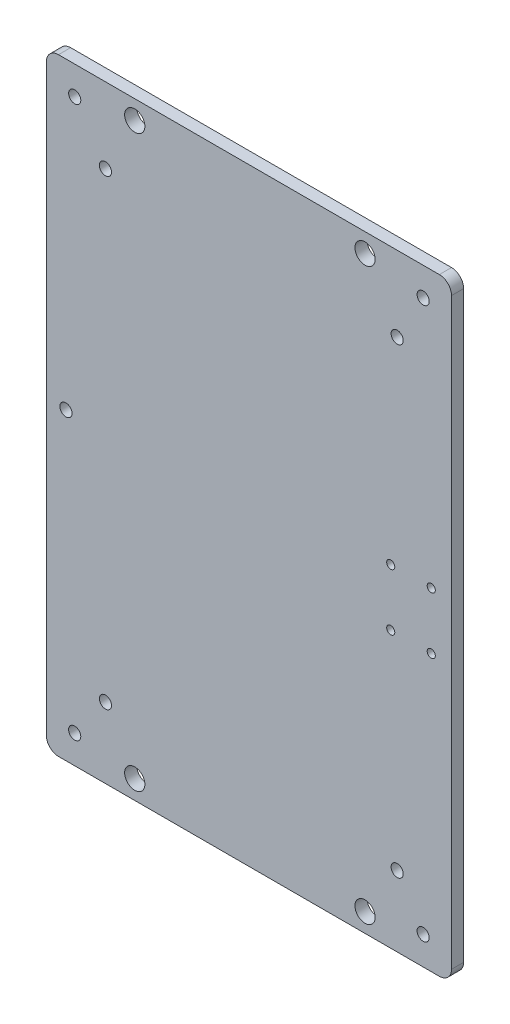
ISO-10303-21;
HEADER;
FILE_DESCRIPTION(('STEP AP214'),'2;1');
FILE_NAME('part.step','',(''),(''),'','','');
FILE_SCHEMA(('AUTOMOTIVE_DESIGN { 1 0 10303 214 1 1 1 1 }'));
ENDSEC;
DATA;
#1=APPLICATION_CONTEXT('core data for automotive mechanical design processes');
#2=APPLICATION_PROTOCOL_DEFINITION('international standard','automotive_design',2000,#1);
#3=PRODUCT_CONTEXT('',#1,'mechanical');
#4=PRODUCT('Part','Part','',(#3));
#5=PRODUCT_RELATED_PRODUCT_CATEGORY('part','',(#4));
#6=PRODUCT_DEFINITION_FORMATION('','',#4);
#7=PRODUCT_DEFINITION_CONTEXT('part definition',#1,'design');
#8=PRODUCT_DEFINITION('design','',#6,#7);
#9=PRODUCT_DEFINITION_SHAPE('','',#8);
#10=(LENGTH_UNIT() NAMED_UNIT(*) SI_UNIT(.MILLI.,.METRE.));
#11=(NAMED_UNIT(*) PLANE_ANGLE_UNIT() SI_UNIT($,.RADIAN.));
#12=(NAMED_UNIT(*) SI_UNIT($,.STERADIAN.) SOLID_ANGLE_UNIT());
#13=UNCERTAINTY_MEASURE_WITH_UNIT(LENGTH_MEASURE(1.E-05),#10,'distance_accuracy_value','');
#14=(GEOMETRIC_REPRESENTATION_CONTEXT(3) GLOBAL_UNCERTAINTY_ASSIGNED_CONTEXT((#13)) GLOBAL_UNIT_ASSIGNED_CONTEXT((#10,
#11,#12)) REPRESENTATION_CONTEXT('',''));
#15=CARTESIAN_POINT('',(0.,0.,0.));
#16=DIRECTION('',(0.,0.,1.));
#17=DIRECTION('',(1.,0.,0.));
#18=AXIS2_PLACEMENT_3D('',#15,#16,#17);
#19=CARTESIAN_POINT('',(-102.,-59.,-3.));
#20=DIRECTION('',(0.,0.,1.));
#21=DIRECTION('',(1.,0.,0.));
#22=AXIS2_PLACEMENT_3D('',#19,#20,#21);
#23=CYLINDRICAL_SURFACE('',#22,3.);
#24=CARTESIAN_POINT('',(-102.,-59.,0.));
#25=DIRECTION('',(0.,0.,1.));
#26=DIRECTION('',(1.,0.,0.));
#27=AXIS2_PLACEMENT_3D('',#24,#25,#26);
#28=CIRCLE('',#27,3.);
#29=CARTESIAN_POINT('',(-105.,-59.,0.));
#30=VERTEX_POINT('',#29);
#31=CARTESIAN_POINT('',(-102.,-62.,0.));
#32=VERTEX_POINT('',#31);
#33=EDGE_CURVE('E133',#30,#32,#28,.T.);
#34=ORIENTED_EDGE('',*,*,#33,.F.);
#35=DIRECTION('',(0.,0.,1.));
#36=VECTOR('',#35,1.);
#37=CARTESIAN_POINT('',(-105.,-59.,-3.));
#38=LINE('',#37,#36);
#39=CARTESIAN_POINT('',(-105.,-59.,-3.));
#40=VERTEX_POINT('',#39);
#41=EDGE_CURVE('E11',#40,#30,#38,.T.);
#42=ORIENTED_EDGE('',*,*,#41,.F.);
#43=CARTESIAN_POINT('',(-102.,-59.,-3.));
#44=DIRECTION('',(0.,0.,1.));
#45=DIRECTION('',(1.,0.,0.));
#46=AXIS2_PLACEMENT_3D('',#43,#44,#45);
#47=CIRCLE('',#46,3.);
#48=CARTESIAN_POINT('',(-102.,-62.,-3.));
#49=VERTEX_POINT('',#48);
#50=EDGE_CURVE('E154',#40,#49,#47,.T.);
#51=ORIENTED_EDGE('',*,*,#50,.T.);
#52=DIRECTION('',(0.,0.,1.));
#53=VECTOR('',#52,1.);
#54=CARTESIAN_POINT('',(-102.,-62.,-3.));
#55=LINE('',#54,#53);
#56=EDGE_CURVE('E39',#49,#32,#55,.T.);
#57=ORIENTED_EDGE('',*,*,#56,.T.);
#58=EDGE_LOOP('',(#34,#42,#51,#57));
#59=FACE_BOUND('',#58,.T.);
#60=ADVANCED_FACE('F36',(#59),#23,.T.);
#61=CARTESIAN_POINT('',(-105.,85.,-3.));
#62=DIRECTION('',(-1.,0.,0.));
#63=DIRECTION('',(0.,0.,1.));
#64=AXIS2_PLACEMENT_3D('',#61,#62,#63);
#65=PLANE('',#64);
#66=DIRECTION('',(0.,-1.,0.));
#67=VECTOR('',#66,1.);
#68=CARTESIAN_POINT('',(-105.,85.,0.));
#69=LINE('',#68,#67);
#70=CARTESIAN_POINT('',(-105.,85.,0.));
#71=VERTEX_POINT('',#70);
#72=EDGE_CURVE('E152',#71,#30,#69,.T.);
#73=ORIENTED_EDGE('',*,*,#72,.F.);
#74=DIRECTION('',(0.,0.,1.));
#75=VECTOR('',#74,1.);
#76=CARTESIAN_POINT('',(-105.,85.,-3.));
#77=LINE('',#76,#75);
#78=CARTESIAN_POINT('',(-105.,85.,-3.));
#79=VERTEX_POINT('',#78);
#80=EDGE_CURVE('E45',#79,#71,#77,.T.);
#81=ORIENTED_EDGE('',*,*,#80,.F.);
#82=DIRECTION('',(0.,-1.,0.));
#83=VECTOR('',#82,1.);
#84=CARTESIAN_POINT('',(-105.,85.,-3.));
#85=LINE('',#84,#83);
#86=EDGE_CURVE('E123',#79,#40,#85,.T.);
#87=ORIENTED_EDGE('',*,*,#86,.T.);
#88=ORIENTED_EDGE('',*,*,#41,.T.);
#89=EDGE_LOOP('',(#73,#81,#87,#88));
#90=FACE_BOUND('',#89,.T.);
#91=ADVANCED_FACE('F166',(#90),#65,.T.);
#92=CARTESIAN_POINT('',(-102.,85.,-3.));
#93=DIRECTION('',(0.,0.,1.));
#94=DIRECTION('',(1.,0.,0.));
#95=AXIS2_PLACEMENT_3D('',#92,#93,#94);
#96=CYLINDRICAL_SURFACE('',#95,3.);
#97=CARTESIAN_POINT('',(-102.,85.,0.));
#98=DIRECTION('',(0.,0.,1.));
#99=DIRECTION('',(1.,0.,0.));
#100=AXIS2_PLACEMENT_3D('',#97,#98,#99);
#101=CIRCLE('',#100,3.);
#102=CARTESIAN_POINT('',(-102.,88.,0.));
#103=VERTEX_POINT('',#102);
#104=EDGE_CURVE('E110',#103,#71,#101,.T.);
#105=ORIENTED_EDGE('',*,*,#104,.F.);
#106=DIRECTION('',(0.,0.,1.));
#107=VECTOR('',#106,1.);
#108=CARTESIAN_POINT('',(-102.,88.,-3.));
#109=LINE('',#108,#107);
#110=CARTESIAN_POINT('',(-102.,88.,-3.));
#111=VERTEX_POINT('',#110);
#112=EDGE_CURVE('E105',#111,#103,#109,.T.);
#113=ORIENTED_EDGE('',*,*,#112,.F.);
#114=CARTESIAN_POINT('',(-102.,85.,-3.));
#115=DIRECTION('',(0.,0.,1.));
#116=DIRECTION('',(1.,0.,0.));
#117=AXIS2_PLACEMENT_3D('',#114,#115,#116);
#118=CIRCLE('',#117,3.);
#119=EDGE_CURVE('E108',#111,#79,#118,.T.);
#120=ORIENTED_EDGE('',*,*,#119,.T.);
#121=ORIENTED_EDGE('',*,*,#80,.T.);
#122=EDGE_LOOP('',(#105,#113,#120,#121));
#123=FACE_BOUND('',#122,.T.);
#124=ADVANCED_FACE('F107',(#123),#96,.T.);
#125=CARTESIAN_POINT('',(-8.,88.,-3.));
#126=DIRECTION('',(0.,1.,0.));
#127=DIRECTION('',(0.,0.,1.));
#128=AXIS2_PLACEMENT_3D('',#125,#126,#127);
#129=PLANE('',#128);
#130=DIRECTION('',(-1.,0.,0.));
#131=VECTOR('',#130,1.);
#132=CARTESIAN_POINT('',(-8.,88.,0.));
#133=LINE('',#132,#131);
#134=CARTESIAN_POINT('',(-8.,88.,0.));
#135=VERTEX_POINT('',#134);
#136=EDGE_CURVE('E149',#135,#103,#133,.T.);
#137=ORIENTED_EDGE('',*,*,#136,.F.);
#138=DIRECTION('',(0.,0.,1.));
#139=VECTOR('',#138,1.);
#140=CARTESIAN_POINT('',(-8.,88.,-3.));
#141=LINE('',#140,#139);
#142=CARTESIAN_POINT('',(-8.,88.,-3.));
#143=VERTEX_POINT('',#142);
#144=EDGE_CURVE('E115',#143,#135,#141,.T.);
#145=ORIENTED_EDGE('',*,*,#144,.F.);
#146=DIRECTION('',(-1.,0.,0.));
#147=VECTOR('',#146,1.);
#148=CARTESIAN_POINT('',(-8.,88.,-3.));
#149=LINE('',#148,#147);
#150=EDGE_CURVE('E121',#143,#111,#149,.T.);
#151=ORIENTED_EDGE('',*,*,#150,.T.);
#152=ORIENTED_EDGE('',*,*,#112,.T.);
#153=EDGE_LOOP('',(#137,#145,#151,#152));
#154=FACE_BOUND('',#153,.T.);
#155=ADVANCED_FACE('F125',(#154),#129,.T.);
#156=CARTESIAN_POINT('',(-8.,85.,-3.));
#157=DIRECTION('',(0.,0.,1.));
#158=DIRECTION('',(1.,0.,0.));
#159=AXIS2_PLACEMENT_3D('',#156,#157,#158);
#160=CYLINDRICAL_SURFACE('',#159,2.99999999999999);
#161=CARTESIAN_POINT('',(-8.,85.,0.));
#162=DIRECTION('',(0.,0.,1.));
#163=DIRECTION('',(1.,0.,0.));
#164=AXIS2_PLACEMENT_3D('',#161,#162,#163);
#165=CIRCLE('',#164,2.99999999999999);
#166=CARTESIAN_POINT('',(-5.,85.,0.));
#167=VERTEX_POINT('',#166);
#168=EDGE_CURVE('E146',#167,#135,#165,.T.);
#169=ORIENTED_EDGE('',*,*,#168,.F.);
#170=DIRECTION('',(0.,0.,1.));
#171=VECTOR('',#170,1.);
#172=CARTESIAN_POINT('',(-5.,85.,-3.));
#173=LINE('',#172,#171);
#174=CARTESIAN_POINT('',(-5.,85.,-3.));
#175=VERTEX_POINT('',#174);
#176=EDGE_CURVE('E158',#175,#167,#173,.T.);
#177=ORIENTED_EDGE('',*,*,#176,.F.);
#178=CARTESIAN_POINT('',(-8.,85.,-3.));
#179=DIRECTION('',(0.,0.,1.));
#180=DIRECTION('',(1.,0.,0.));
#181=AXIS2_PLACEMENT_3D('',#178,#179,#180);
#182=CIRCLE('',#181,2.99999999999999);
#183=EDGE_CURVE('E126',#175,#143,#182,.T.);
#184=ORIENTED_EDGE('',*,*,#183,.T.);
#185=ORIENTED_EDGE('',*,*,#144,.T.);
#186=EDGE_LOOP('',(#169,#177,#184,#185));
#187=FACE_BOUND('',#186,.T.);
#188=ADVANCED_FACE('F179',(#187),#160,.T.);
#189=CARTESIAN_POINT('',(-5.,-59.,-3.));
#190=DIRECTION('',(1.,0.,0.));
#191=DIRECTION('',(0.,0.,-1.));
#192=AXIS2_PLACEMENT_3D('',#189,#190,#191);
#193=PLANE('',#192);
#194=DIRECTION('',(0.,1.,0.));
#195=VECTOR('',#194,1.);
#196=CARTESIAN_POINT('',(-5.,-59.,0.));
#197=LINE('',#196,#195);
#198=CARTESIAN_POINT('',(-5.,-59.,0.));
#199=VERTEX_POINT('',#198);
#200=EDGE_CURVE('E143',#199,#167,#197,.T.);
#201=ORIENTED_EDGE('',*,*,#200,.F.);
#202=DIRECTION('',(0.,0.,1.));
#203=VECTOR('',#202,1.);
#204=CARTESIAN_POINT('',(-5.,-59.,-3.));
#205=LINE('',#204,#203);
#206=CARTESIAN_POINT('',(-5.,-59.,-3.));
#207=VERTEX_POINT('',#206);
#208=EDGE_CURVE('E160',#207,#199,#205,.T.);
#209=ORIENTED_EDGE('',*,*,#208,.F.);
#210=DIRECTION('',(0.,1.,0.));
#211=VECTOR('',#210,1.);
#212=CARTESIAN_POINT('',(-5.,-59.,-3.));
#213=LINE('',#212,#211);
#214=EDGE_CURVE('E128',#207,#175,#213,.T.);
#215=ORIENTED_EDGE('',*,*,#214,.T.);
#216=ORIENTED_EDGE('',*,*,#176,.T.);
#217=EDGE_LOOP('',(#201,#209,#215,#216));
#218=FACE_BOUND('',#217,.T.);
#219=ADVANCED_FACE('F182',(#218),#193,.T.);
#220=CARTESIAN_POINT('',(-8.,-59.,-3.));
#221=DIRECTION('',(0.,0.,1.));
#222=DIRECTION('',(1.,0.,0.));
#223=AXIS2_PLACEMENT_3D('',#220,#221,#222);
#224=CYLINDRICAL_SURFACE('',#223,3.);
#225=CARTESIAN_POINT('',(-8.,-59.,0.));
#226=DIRECTION('',(0.,0.,1.));
#227=DIRECTION('',(1.,0.,0.));
#228=AXIS2_PLACEMENT_3D('',#225,#226,#227);
#229=CIRCLE('',#228,3.);
#230=CARTESIAN_POINT('',(-8.,-62.,0.));
#231=VERTEX_POINT('',#230);
#232=EDGE_CURVE('E140',#231,#199,#229,.T.);
#233=ORIENTED_EDGE('',*,*,#232,.F.);
#234=DIRECTION('',(0.,0.,1.));
#235=VECTOR('',#234,1.);
#236=CARTESIAN_POINT('',(-8.,-62.,-3.));
#237=LINE('',#236,#235);
#238=CARTESIAN_POINT('',(-8.,-62.,-3.));
#239=VERTEX_POINT('',#238);
#240=EDGE_CURVE('E161',#239,#231,#237,.T.);
#241=ORIENTED_EDGE('',*,*,#240,.F.);
#242=CARTESIAN_POINT('',(-8.,-59.,-3.));
#243=DIRECTION('',(0.,0.,1.));
#244=DIRECTION('',(1.,0.,0.));
#245=AXIS2_PLACEMENT_3D('',#242,#243,#244);
#246=CIRCLE('',#245,3.);
#247=EDGE_CURVE('E375',#239,#207,#246,.T.);
#248=ORIENTED_EDGE('',*,*,#247,.T.);
#249=ORIENTED_EDGE('',*,*,#208,.T.);
#250=EDGE_LOOP('',(#233,#241,#248,#249));
#251=FACE_BOUND('',#250,.T.);
#252=ADVANCED_FACE('F186',(#251),#224,.T.);
#253=CARTESIAN_POINT('',(-102.,-62.,-3.));
#254=DIRECTION('',(0.,-1.,0.));
#255=DIRECTION('',(0.,0.,-1.));
#256=AXIS2_PLACEMENT_3D('',#253,#254,#255);
#257=PLANE('',#256);
#258=DIRECTION('',(1.,0.,0.));
#259=VECTOR('',#258,1.);
#260=CARTESIAN_POINT('',(-102.,-62.,0.));
#261=LINE('',#260,#259);
#262=EDGE_CURVE('E136',#32,#231,#261,.T.);
#263=ORIENTED_EDGE('',*,*,#262,.F.);
#264=ORIENTED_EDGE('',*,*,#56,.F.);
#265=DIRECTION('',(1.,0.,0.));
#266=VECTOR('',#265,1.);
#267=CARTESIAN_POINT('',(-102.,-62.,-3.));
#268=LINE('',#267,#266);
#269=EDGE_CURVE('E373',#49,#239,#268,.T.);
#270=ORIENTED_EDGE('',*,*,#269,.T.);
#271=ORIENTED_EDGE('',*,*,#240,.T.);
#272=EDGE_LOOP('',(#263,#264,#270,#271));
#273=FACE_BOUND('',#272,.T.);
#274=ADVANCED_FACE('F163',(#273),#257,.T.);
#275=CARTESIAN_POINT('',(-102.,-59.,-3.));
#276=DIRECTION('',(0.,0.,1.));
#277=DIRECTION('',(1.,0.,0.));
#278=AXIS2_PLACEMENT_3D('',#275,#276,#277);
#279=PLANE('',#278);
#280=CARTESIAN_POINT('',(-26.3347200903665,83.33,-3.));
#281=DIRECTION('',(0.,0.,1.));
#282=DIRECTION('',(1.,0.,0.));
#283=AXIS2_PLACEMENT_3D('',#280,#281,#282);
#284=CIRCLE('',#283,2.5);
#285=CARTESIAN_POINT('',(-23.8347200903665,83.33,-3.));
#286=VERTEX_POINT('',#285);
#287=EDGE_CURVE('E276',#286,#286,#284,.T.);
#288=ORIENTED_EDGE('',*,*,#287,.T.);
#289=EDGE_LOOP('',(#288));
#290=FACE_BOUND('',#289,.T.);
#291=CARTESIAN_POINT('',(-83.1786162713773,83.33,-3.));
#292=DIRECTION('',(0.,0.,1.));
#293=DIRECTION('',(1.,0.,0.));
#294=AXIS2_PLACEMENT_3D('',#291,#292,#293);
#295=CIRCLE('',#294,2.5);
#296=CARTESIAN_POINT('',(-80.6786162713773,83.33,-3.));
#297=VERTEX_POINT('',#296);
#298=EDGE_CURVE('E278',#297,#297,#295,.T.);
#299=ORIENTED_EDGE('',*,*,#298,.T.);
#300=EDGE_LOOP('',(#299));
#301=FACE_BOUND('',#300,.T.);
#302=CARTESIAN_POINT('',(-26.3347200903665,-57.3266391463334,-3.));
#303=DIRECTION('',(0.,0.,1.));
#304=DIRECTION('',(1.,0.,0.));
#305=AXIS2_PLACEMENT_3D('',#302,#303,#304);
#306=CIRCLE('',#305,2.5);
#307=CARTESIAN_POINT('',(-23.8347200903665,-57.3266391463334,-3.));
#308=VERTEX_POINT('',#307);
#309=EDGE_CURVE('E292',#308,#308,#306,.T.);
#310=ORIENTED_EDGE('',*,*,#309,.T.);
#311=EDGE_LOOP('',(#310));
#312=FACE_BOUND('',#311,.T.);
#313=CARTESIAN_POINT('',(-83.1786162713773,-57.3266391463334,-3.));
#314=DIRECTION('',(0.,0.,1.));
#315=DIRECTION('',(1.,0.,0.));
#316=AXIS2_PLACEMENT_3D('',#313,#314,#315);
#317=CIRCLE('',#316,2.5);
#318=CARTESIAN_POINT('',(-80.6786162713773,-57.3266391463334,-3.));
#319=VERTEX_POINT('',#318);
#320=EDGE_CURVE('E288',#319,#319,#317,.T.);
#321=ORIENTED_EDGE('',*,*,#320,.T.);
#322=EDGE_LOOP('',(#321));
#323=FACE_BOUND('',#322,.T.);
#324=CARTESIAN_POINT('',(-90.41,69.42,-3.));
#325=DIRECTION('',(0.,0.,1.));
#326=DIRECTION('',(1.,0.,0.));
#327=AXIS2_PLACEMENT_3D('',#324,#325,#326);
#328=CIRCLE('',#327,1.5);
#329=CARTESIAN_POINT('',(-88.91,69.42,-3.));
#330=VERTEX_POINT('',#329);
#331=EDGE_CURVE('E316',#330,#330,#328,.T.);
#332=ORIENTED_EDGE('',*,*,#331,.T.);
#333=EDGE_LOOP('',(#332));
#334=FACE_BOUND('',#333,.T.);
#335=CARTESIAN_POINT('',(-18.41,69.42,-3.));
#336=DIRECTION('',(0.,0.,1.));
#337=DIRECTION('',(1.,0.,0.));
#338=AXIS2_PLACEMENT_3D('',#335,#336,#337);
#339=CIRCLE('',#338,1.5);
#340=CARTESIAN_POINT('',(-16.91,69.42,-3.));
#341=VERTEX_POINT('',#340);
#342=EDGE_CURVE('E313',#341,#341,#339,.T.);
#343=ORIENTED_EDGE('',*,*,#342,.T.);
#344=EDGE_LOOP('',(#343));
#345=FACE_BOUND('',#344,.T.);
#346=CARTESIAN_POINT('',(-18.41,-44.58,-3.));
#347=DIRECTION('',(0.,0.,1.));
#348=DIRECTION('',(1.,0.,0.));
#349=AXIS2_PLACEMENT_3D('',#346,#347,#348);
#350=CIRCLE('',#349,1.5);
#351=CARTESIAN_POINT('',(-16.91,-44.58,-3.));
#352=VERTEX_POINT('',#351);
#353=EDGE_CURVE('E310',#352,#352,#350,.T.);
#354=ORIENTED_EDGE('',*,*,#353,.T.);
#355=EDGE_LOOP('',(#354));
#356=FACE_BOUND('',#355,.T.);
#357=CARTESIAN_POINT('',(-90.41,-44.58,-3.));
#358=DIRECTION('',(0.,0.,1.));
#359=DIRECTION('',(1.,0.,0.));
#360=AXIS2_PLACEMENT_3D('',#357,#358,#359);
#361=CIRCLE('',#360,1.50000000000001);
#362=CARTESIAN_POINT('',(-88.91,-44.58,-3.));
#363=VERTEX_POINT('',#362);
#364=EDGE_CURVE('E307',#363,#363,#361,.T.);
#365=ORIENTED_EDGE('',*,*,#364,.T.);
#366=EDGE_LOOP('',(#365));
#367=FACE_BOUND('',#366,.T.);
#368=CARTESIAN_POINT('',(-10.,20.,-3.));
#369=DIRECTION('',(0.,0.,1.));
#370=DIRECTION('',(-1.,0.,0.));
#371=AXIS2_PLACEMENT_3D('',#368,#369,#370);
#372=CIRCLE('',#371,0.999999999999999);
#373=CARTESIAN_POINT('',(-11.,20.,-3.));
#374=VERTEX_POINT('',#373);
#375=EDGE_CURVE('E320',#374,#374,#372,.T.);
#376=ORIENTED_EDGE('',*,*,#375,.T.);
#377=EDGE_LOOP('',(#376));
#378=FACE_BOUND('',#377,.T.);
#379=CARTESIAN_POINT('',(-20.,6.,-3.));
#380=DIRECTION('',(0.,0.,1.));
#381=DIRECTION('',(-1.,0.,0.));
#382=AXIS2_PLACEMENT_3D('',#379,#380,#381);
#383=CIRCLE('',#382,1.);
#384=CARTESIAN_POINT('',(-21.,6.,-3.));
#385=VERTEX_POINT('',#384);
#386=EDGE_CURVE('E326',#385,#385,#383,.T.);
#387=ORIENTED_EDGE('',*,*,#386,.T.);
#388=EDGE_LOOP('',(#387));
#389=FACE_BOUND('',#388,.T.);
#390=CARTESIAN_POINT('',(-20.,20.,-3.));
#391=DIRECTION('',(0.,0.,1.));
#392=DIRECTION('',(-1.,0.,0.));
#393=AXIS2_PLACEMENT_3D('',#390,#391,#392);
#394=CIRCLE('',#393,1.);
#395=CARTESIAN_POINT('',(-21.,20.,-3.));
#396=VERTEX_POINT('',#395);
#397=EDGE_CURVE('E332',#396,#396,#394,.T.);
#398=ORIENTED_EDGE('',*,*,#397,.T.);
#399=EDGE_LOOP('',(#398));
#400=FACE_BOUND('',#399,.T.);
#401=CARTESIAN_POINT('',(-10.,6.,-3.));
#402=DIRECTION('',(0.,0.,1.));
#403=DIRECTION('',(-1.,0.,0.));
#404=AXIS2_PLACEMENT_3D('',#401,#402,#403);
#405=CIRCLE('',#404,0.999999999999999);
#406=CARTESIAN_POINT('',(-11.,6.,-3.));
#407=VERTEX_POINT('',#406);
#408=EDGE_CURVE('E338',#407,#407,#405,.T.);
#409=ORIENTED_EDGE('',*,*,#408,.T.);
#410=EDGE_LOOP('',(#409));
#411=FACE_BOUND('',#410,.T.);
#412=CARTESIAN_POINT('',(-12.,-55.,-3.));
#413=DIRECTION('',(0.,0.,1.));
#414=DIRECTION('',(-1.,0.,0.));
#415=AXIS2_PLACEMENT_3D('',#412,#413,#414);
#416=CIRCLE('',#415,1.5);
#417=CARTESIAN_POINT('',(-13.5,-55.,-3.));
#418=VERTEX_POINT('',#417);
#419=EDGE_CURVE('E344',#418,#418,#416,.T.);
#420=ORIENTED_EDGE('',*,*,#419,.T.);
#421=EDGE_LOOP('',(#420));
#422=FACE_BOUND('',#421,.T.);
#423=CARTESIAN_POINT('',(-98.,81.,-3.));
#424=DIRECTION('',(0.,0.,1.));
#425=DIRECTION('',(-1.,0.,0.));
#426=AXIS2_PLACEMENT_3D('',#423,#424,#425);
#427=CIRCLE('',#426,1.5);
#428=CARTESIAN_POINT('',(-99.5,81.,-3.));
#429=VERTEX_POINT('',#428);
#430=EDGE_CURVE('E350',#429,#429,#427,.T.);
#431=ORIENTED_EDGE('',*,*,#430,.T.);
#432=EDGE_LOOP('',(#431));
#433=FACE_BOUND('',#432,.T.);
#434=CARTESIAN_POINT('',(-98.,-55.,-3.));
#435=DIRECTION('',(0.,0.,1.));
#436=DIRECTION('',(-1.,0.,0.));
#437=AXIS2_PLACEMENT_3D('',#434,#435,#436);
#438=CIRCLE('',#437,1.5);
#439=CARTESIAN_POINT('',(-99.5,-55.,-3.));
#440=VERTEX_POINT('',#439);
#441=EDGE_CURVE('E356',#440,#440,#438,.T.);
#442=ORIENTED_EDGE('',*,*,#441,.T.);
#443=EDGE_LOOP('',(#442));
#444=FACE_BOUND('',#443,.T.);
#445=CARTESIAN_POINT('',(-12.,81.,-3.));
#446=DIRECTION('',(0.,0.,1.));
#447=DIRECTION('',(-1.,0.,0.));
#448=AXIS2_PLACEMENT_3D('',#445,#446,#447);
#449=CIRCLE('',#448,1.5);
#450=CARTESIAN_POINT('',(-13.5,81.,-3.));
#451=VERTEX_POINT('',#450);
#452=EDGE_CURVE('E362',#451,#451,#449,.T.);
#453=ORIENTED_EDGE('',*,*,#452,.T.);
#454=EDGE_LOOP('',(#453));
#455=FACE_BOUND('',#454,.T.);
#456=CARTESIAN_POINT('',(-100.157022476196,13.,-3.));
#457=DIRECTION('',(0.,0.,1.));
#458=DIRECTION('',(-1.,0.,0.));
#459=AXIS2_PLACEMENT_3D('',#456,#457,#458);
#460=CIRCLE('',#459,1.5);
#461=CARTESIAN_POINT('',(-101.657022476196,13.,-3.));
#462=VERTEX_POINT('',#461);
#463=EDGE_CURVE('E137',#462,#462,#460,.T.);
#464=ORIENTED_EDGE('',*,*,#463,.T.);
#465=EDGE_LOOP('',(#464));
#466=FACE_BOUND('',#465,.T.);
#467=ORIENTED_EDGE('',*,*,#50,.F.);
#468=ORIENTED_EDGE('',*,*,#86,.F.);
#469=ORIENTED_EDGE('',*,*,#119,.F.);
#470=ORIENTED_EDGE('',*,*,#150,.F.);
#471=ORIENTED_EDGE('',*,*,#183,.F.);
#472=ORIENTED_EDGE('',*,*,#214,.F.);
#473=ORIENTED_EDGE('',*,*,#247,.F.);
#474=ORIENTED_EDGE('',*,*,#269,.F.);
#475=EDGE_LOOP('',(#467,#468,#469,#470,#471,#472,#473,#474));
#476=FACE_BOUND('',#475,.T.);
#477=ADVANCED_FACE('F119',(#290,#301,#312,#323,#334,#345,#356,#367,#378,#389,#400,#411,#422,
#433,#444,#455,#466,#476),#279,.F.);
#478=CARTESIAN_POINT('',(-102.,-59.,0.));
#479=DIRECTION('',(0.,0.,1.));
#480=DIRECTION('',(1.,0.,0.));
#481=AXIS2_PLACEMENT_3D('',#478,#479,#480);
#482=PLANE('',#481);
#483=CARTESIAN_POINT('',(-26.3347200903665,83.33,0.));
#484=DIRECTION('',(0.,0.,1.));
#485=DIRECTION('',(1.,0.,0.));
#486=AXIS2_PLACEMENT_3D('',#483,#484,#485);
#487=CIRCLE('',#486,2.5);
#488=CARTESIAN_POINT('',(-23.8347200903665,83.33,0.));
#489=VERTEX_POINT('',#488);
#490=EDGE_CURVE('E274',#489,#489,#487,.T.);
#491=ORIENTED_EDGE('',*,*,#490,.F.);
#492=EDGE_LOOP('',(#491));
#493=FACE_BOUND('',#492,.T.);
#494=CARTESIAN_POINT('',(-83.1786162713773,83.33,0.));
#495=DIRECTION('',(0.,0.,1.));
#496=DIRECTION('',(1.,0.,0.));
#497=AXIS2_PLACEMENT_3D('',#494,#495,#496);
#498=CIRCLE('',#497,2.5);
#499=CARTESIAN_POINT('',(-80.6786162713773,83.33,0.));
#500=VERTEX_POINT('',#499);
#501=EDGE_CURVE('E457',#500,#500,#498,.T.);
#502=ORIENTED_EDGE('',*,*,#501,.F.);
#503=EDGE_LOOP('',(#502));
#504=FACE_BOUND('',#503,.T.);
#505=CARTESIAN_POINT('',(-26.3347200903665,-57.3266391463334,0.));
#506=DIRECTION('',(0.,0.,1.));
#507=DIRECTION('',(1.,0.,0.));
#508=AXIS2_PLACEMENT_3D('',#505,#506,#507);
#509=CIRCLE('',#508,2.5);
#510=CARTESIAN_POINT('',(-23.8347200903665,-57.3266391463334,0.));
#511=VERTEX_POINT('',#510);
#512=EDGE_CURVE('E281',#511,#511,#509,.T.);
#513=ORIENTED_EDGE('',*,*,#512,.F.);
#514=EDGE_LOOP('',(#513));
#515=FACE_BOUND('',#514,.T.);
#516=CARTESIAN_POINT('',(-83.1786162713773,-57.3266391463334,0.));
#517=DIRECTION('',(0.,0.,1.));
#518=DIRECTION('',(1.,0.,0.));
#519=AXIS2_PLACEMENT_3D('',#516,#517,#518);
#520=CIRCLE('',#519,2.5);
#521=CARTESIAN_POINT('',(-80.6786162713773,-57.3266391463334,0.));
#522=VERTEX_POINT('',#521);
#523=EDGE_CURVE('E277',#522,#522,#520,.T.);
#524=ORIENTED_EDGE('',*,*,#523,.F.);
#525=EDGE_LOOP('',(#524));
#526=FACE_BOUND('',#525,.T.);
#527=CARTESIAN_POINT('',(-90.41,69.42,0.));
#528=DIRECTION('',(0.,0.,1.));
#529=DIRECTION('',(1.,0.,0.));
#530=AXIS2_PLACEMENT_3D('',#527,#528,#529);
#531=CIRCLE('',#530,1.5);
#532=CARTESIAN_POINT('',(-88.91,69.42,0.));
#533=VERTEX_POINT('',#532);
#534=EDGE_CURVE('E295',#533,#533,#531,.T.);
#535=ORIENTED_EDGE('',*,*,#534,.F.);
#536=EDGE_LOOP('',(#535));
#537=FACE_BOUND('',#536,.T.);
#538=CARTESIAN_POINT('',(-18.41,69.42,0.));
#539=DIRECTION('',(0.,0.,1.));
#540=DIRECTION('',(1.,0.,0.));
#541=AXIS2_PLACEMENT_3D('',#538,#539,#540);
#542=CIRCLE('',#541,1.5);
#543=CARTESIAN_POINT('',(-16.91,69.42,0.));
#544=VERTEX_POINT('',#543);
#545=EDGE_CURVE('E300',#544,#544,#542,.T.);
#546=ORIENTED_EDGE('',*,*,#545,.F.);
#547=EDGE_LOOP('',(#546));
#548=FACE_BOUND('',#547,.T.);
#549=CARTESIAN_POINT('',(-18.41,-44.58,0.));
#550=DIRECTION('',(0.,0.,1.));
#551=DIRECTION('',(1.,0.,0.));
#552=AXIS2_PLACEMENT_3D('',#549,#550,#551);
#553=CIRCLE('',#552,1.5);
#554=CARTESIAN_POINT('',(-16.91,-44.58,0.));
#555=VERTEX_POINT('',#554);
#556=EDGE_CURVE('E296',#555,#555,#553,.T.);
#557=ORIENTED_EDGE('',*,*,#556,.F.);
#558=EDGE_LOOP('',(#557));
#559=FACE_BOUND('',#558,.T.);
#560=CARTESIAN_POINT('',(-90.41,-44.58,0.));
#561=DIRECTION('',(0.,0.,1.));
#562=DIRECTION('',(1.,0.,0.));
#563=AXIS2_PLACEMENT_3D('',#560,#561,#562);
#564=CIRCLE('',#563,1.50000000000001);
#565=CARTESIAN_POINT('',(-88.91,-44.58,0.));
#566=VERTEX_POINT('',#565);
#567=EDGE_CURVE('E299',#566,#566,#564,.T.);
#568=ORIENTED_EDGE('',*,*,#567,.F.);
#569=EDGE_LOOP('',(#568));
#570=FACE_BOUND('',#569,.T.);
#571=CARTESIAN_POINT('',(-10.,20.,0.));
#572=DIRECTION('',(0.,0.,1.));
#573=DIRECTION('',(-1.,0.,0.));
#574=AXIS2_PLACEMENT_3D('',#571,#572,#573);
#575=CIRCLE('',#574,0.999999999999999);
#576=CARTESIAN_POINT('',(-11.,20.,0.));
#577=VERTEX_POINT('',#576);
#578=EDGE_CURVE('E319',#577,#577,#575,.T.);
#579=ORIENTED_EDGE('',*,*,#578,.F.);
#580=EDGE_LOOP('',(#579));
#581=FACE_BOUND('',#580,.T.);
#582=CARTESIAN_POINT('',(-20.,6.,0.));
#583=DIRECTION('',(0.,0.,1.));
#584=DIRECTION('',(-1.,0.,0.));
#585=AXIS2_PLACEMENT_3D('',#582,#583,#584);
#586=CIRCLE('',#585,1.);
#587=CARTESIAN_POINT('',(-21.,6.,0.));
#588=VERTEX_POINT('',#587);
#589=EDGE_CURVE('E323',#588,#588,#586,.T.);
#590=ORIENTED_EDGE('',*,*,#589,.F.);
#591=EDGE_LOOP('',(#590));
#592=FACE_BOUND('',#591,.T.);
#593=CARTESIAN_POINT('',(-20.,20.,0.));
#594=DIRECTION('',(0.,0.,1.));
#595=DIRECTION('',(-1.,0.,0.));
#596=AXIS2_PLACEMENT_3D('',#593,#594,#595);
#597=CIRCLE('',#596,1.);
#598=CARTESIAN_POINT('',(-21.,20.,0.));
#599=VERTEX_POINT('',#598);
#600=EDGE_CURVE('E329',#599,#599,#597,.T.);
#601=ORIENTED_EDGE('',*,*,#600,.F.);
#602=EDGE_LOOP('',(#601));
#603=FACE_BOUND('',#602,.T.);
#604=CARTESIAN_POINT('',(-10.,6.,0.));
#605=DIRECTION('',(0.,0.,1.));
#606=DIRECTION('',(-1.,0.,0.));
#607=AXIS2_PLACEMENT_3D('',#604,#605,#606);
#608=CIRCLE('',#607,0.999999999999999);
#609=CARTESIAN_POINT('',(-11.,6.,0.));
#610=VERTEX_POINT('',#609);
#611=EDGE_CURVE('E335',#610,#610,#608,.T.);
#612=ORIENTED_EDGE('',*,*,#611,.F.);
#613=EDGE_LOOP('',(#612));
#614=FACE_BOUND('',#613,.T.);
#615=CARTESIAN_POINT('',(-12.,-55.,0.));
#616=DIRECTION('',(0.,0.,1.));
#617=DIRECTION('',(-1.,0.,0.));
#618=AXIS2_PLACEMENT_3D('',#615,#616,#617);
#619=CIRCLE('',#618,1.5);
#620=CARTESIAN_POINT('',(-13.5,-55.,0.));
#621=VERTEX_POINT('',#620);
#622=EDGE_CURVE('E341',#621,#621,#619,.T.);
#623=ORIENTED_EDGE('',*,*,#622,.F.);
#624=EDGE_LOOP('',(#623));
#625=FACE_BOUND('',#624,.T.);
#626=CARTESIAN_POINT('',(-98.,81.,0.));
#627=DIRECTION('',(0.,0.,1.));
#628=DIRECTION('',(-1.,0.,0.));
#629=AXIS2_PLACEMENT_3D('',#626,#627,#628);
#630=CIRCLE('',#629,1.5);
#631=CARTESIAN_POINT('',(-99.5,81.,0.));
#632=VERTEX_POINT('',#631);
#633=EDGE_CURVE('E347',#632,#632,#630,.T.);
#634=ORIENTED_EDGE('',*,*,#633,.F.);
#635=EDGE_LOOP('',(#634));
#636=FACE_BOUND('',#635,.T.);
#637=CARTESIAN_POINT('',(-98.,-55.,0.));
#638=DIRECTION('',(0.,0.,1.));
#639=DIRECTION('',(-1.,0.,0.));
#640=AXIS2_PLACEMENT_3D('',#637,#638,#639);
#641=CIRCLE('',#640,1.5);
#642=CARTESIAN_POINT('',(-99.5,-55.,0.));
#643=VERTEX_POINT('',#642);
#644=EDGE_CURVE('E353',#643,#643,#641,.T.);
#645=ORIENTED_EDGE('',*,*,#644,.F.);
#646=EDGE_LOOP('',(#645));
#647=FACE_BOUND('',#646,.T.);
#648=CARTESIAN_POINT('',(-12.,81.,0.));
#649=DIRECTION('',(0.,0.,1.));
#650=DIRECTION('',(-1.,0.,0.));
#651=AXIS2_PLACEMENT_3D('',#648,#649,#650);
#652=CIRCLE('',#651,1.5);
#653=CARTESIAN_POINT('',(-13.5,81.,0.));
#654=VERTEX_POINT('',#653);
#655=EDGE_CURVE('E359',#654,#654,#652,.T.);
#656=ORIENTED_EDGE('',*,*,#655,.F.);
#657=EDGE_LOOP('',(#656));
#658=FACE_BOUND('',#657,.T.);
#659=CARTESIAN_POINT('',(-100.157022476196,13.,0.));
#660=DIRECTION('',(0.,0.,1.));
#661=DIRECTION('',(-1.,0.,0.));
#662=AXIS2_PLACEMENT_3D('',#659,#660,#661);
#663=CIRCLE('',#662,1.5);
#664=CARTESIAN_POINT('',(-101.657022476196,13.,0.));
#665=VERTEX_POINT('',#664);
#666=EDGE_CURVE('E365',#665,#665,#663,.T.);
#667=ORIENTED_EDGE('',*,*,#666,.F.);
#668=EDGE_LOOP('',(#667));
#669=FACE_BOUND('',#668,.T.);
#670=ORIENTED_EDGE('',*,*,#33,.T.);
#671=ORIENTED_EDGE('',*,*,#262,.T.);
#672=ORIENTED_EDGE('',*,*,#232,.T.);
#673=ORIENTED_EDGE('',*,*,#200,.T.);
#674=ORIENTED_EDGE('',*,*,#168,.T.);
#675=ORIENTED_EDGE('',*,*,#136,.T.);
#676=ORIENTED_EDGE('',*,*,#104,.T.);
#677=ORIENTED_EDGE('',*,*,#72,.T.);
#678=EDGE_LOOP('',(#670,#671,#672,#673,#674,#675,#676,#677));
#679=FACE_BOUND('',#678,.T.);
#680=ADVANCED_FACE('F165',(#493,#504,#515,#526,#537,#548,#559,#570,#581,#592,#603,#614,#625,
#636,#647,#658,#669,#679),#482,.T.);
#681=CARTESIAN_POINT('',(-100.157022476196,13.,-3.));
#682=DIRECTION('',(0.,0.,1.));
#683=DIRECTION('',(1.,0.,0.));
#684=AXIS2_PLACEMENT_3D('',#681,#682,#683);
#685=CYLINDRICAL_SURFACE('',#684,1.5);
#686=ORIENTED_EDGE('',*,*,#463,.F.);
#687=EDGE_LOOP('',(#686));
#688=FACE_BOUND('',#687,.T.);
#689=ORIENTED_EDGE('',*,*,#666,.T.);
#690=EDGE_LOOP('',(#689));
#691=FACE_BOUND('',#690,.T.);
#692=ADVANCED_FACE('F198',(#688,#691),#685,.F.);
#693=CARTESIAN_POINT('',(-12.,81.,-3.));
#694=DIRECTION('',(0.,0.,1.));
#695=DIRECTION('',(1.,0.,0.));
#696=AXIS2_PLACEMENT_3D('',#693,#694,#695);
#697=CYLINDRICAL_SURFACE('',#696,1.5);
#698=ORIENTED_EDGE('',*,*,#452,.F.);
#699=EDGE_LOOP('',(#698));
#700=FACE_BOUND('',#699,.T.);
#701=ORIENTED_EDGE('',*,*,#655,.T.);
#702=EDGE_LOOP('',(#701));
#703=FACE_BOUND('',#702,.T.);
#704=ADVANCED_FACE('F205',(#700,#703),#697,.F.);
#705=CARTESIAN_POINT('',(-98.,-55.,-3.));
#706=DIRECTION('',(0.,0.,1.));
#707=DIRECTION('',(1.,0.,0.));
#708=AXIS2_PLACEMENT_3D('',#705,#706,#707);
#709=CYLINDRICAL_SURFACE('',#708,1.5);
#710=ORIENTED_EDGE('',*,*,#441,.F.);
#711=EDGE_LOOP('',(#710));
#712=FACE_BOUND('',#711,.T.);
#713=ORIENTED_EDGE('',*,*,#644,.T.);
#714=EDGE_LOOP('',(#713));
#715=FACE_BOUND('',#714,.T.);
#716=ADVANCED_FACE('F209',(#712,#715),#709,.F.);
#717=CARTESIAN_POINT('',(-98.,81.,-3.));
#718=DIRECTION('',(0.,0.,1.));
#719=DIRECTION('',(1.,0.,0.));
#720=AXIS2_PLACEMENT_3D('',#717,#718,#719);
#721=CYLINDRICAL_SURFACE('',#720,1.5);
#722=ORIENTED_EDGE('',*,*,#430,.F.);
#723=EDGE_LOOP('',(#722));
#724=FACE_BOUND('',#723,.T.);
#725=ORIENTED_EDGE('',*,*,#633,.T.);
#726=EDGE_LOOP('',(#725));
#727=FACE_BOUND('',#726,.T.);
#728=ADVANCED_FACE('F213',(#724,#727),#721,.F.);
#729=CARTESIAN_POINT('',(-12.,-55.,-3.));
#730=DIRECTION('',(0.,0.,1.));
#731=DIRECTION('',(1.,0.,0.));
#732=AXIS2_PLACEMENT_3D('',#729,#730,#731);
#733=CYLINDRICAL_SURFACE('',#732,1.5);
#734=ORIENTED_EDGE('',*,*,#419,.F.);
#735=EDGE_LOOP('',(#734));
#736=FACE_BOUND('',#735,.T.);
#737=ORIENTED_EDGE('',*,*,#622,.T.);
#738=EDGE_LOOP('',(#737));
#739=FACE_BOUND('',#738,.T.);
#740=ADVANCED_FACE('F217',(#736,#739),#733,.F.);
#741=CARTESIAN_POINT('',(-10.,6.,-3.));
#742=DIRECTION('',(0.,0.,1.));
#743=DIRECTION('',(1.,0.,0.));
#744=AXIS2_PLACEMENT_3D('',#741,#742,#743);
#745=CYLINDRICAL_SURFACE('',#744,0.999999999999999);
#746=ORIENTED_EDGE('',*,*,#408,.F.);
#747=EDGE_LOOP('',(#746));
#748=FACE_BOUND('',#747,.T.);
#749=ORIENTED_EDGE('',*,*,#611,.T.);
#750=EDGE_LOOP('',(#749));
#751=FACE_BOUND('',#750,.T.);
#752=ADVANCED_FACE('F221',(#748,#751),#745,.F.);
#753=CARTESIAN_POINT('',(-20.,20.,-3.));
#754=DIRECTION('',(0.,0.,1.));
#755=DIRECTION('',(1.,0.,0.));
#756=AXIS2_PLACEMENT_3D('',#753,#754,#755);
#757=CYLINDRICAL_SURFACE('',#756,1.);
#758=ORIENTED_EDGE('',*,*,#397,.F.);
#759=EDGE_LOOP('',(#758));
#760=FACE_BOUND('',#759,.T.);
#761=ORIENTED_EDGE('',*,*,#600,.T.);
#762=EDGE_LOOP('',(#761));
#763=FACE_BOUND('',#762,.T.);
#764=ADVANCED_FACE('F225',(#760,#763),#757,.F.);
#765=CARTESIAN_POINT('',(-20.,6.,-3.));
#766=DIRECTION('',(0.,0.,1.));
#767=DIRECTION('',(1.,0.,0.));
#768=AXIS2_PLACEMENT_3D('',#765,#766,#767);
#769=CYLINDRICAL_SURFACE('',#768,1.);
#770=ORIENTED_EDGE('',*,*,#386,.F.);
#771=EDGE_LOOP('',(#770));
#772=FACE_BOUND('',#771,.T.);
#773=ORIENTED_EDGE('',*,*,#589,.T.);
#774=EDGE_LOOP('',(#773));
#775=FACE_BOUND('',#774,.T.);
#776=ADVANCED_FACE('F229',(#772,#775),#769,.F.);
#777=CARTESIAN_POINT('',(-10.,20.,-3.));
#778=DIRECTION('',(0.,0.,1.));
#779=DIRECTION('',(1.,0.,0.));
#780=AXIS2_PLACEMENT_3D('',#777,#778,#779);
#781=CYLINDRICAL_SURFACE('',#780,0.999999999999999);
#782=ORIENTED_EDGE('',*,*,#375,.F.);
#783=EDGE_LOOP('',(#782));
#784=FACE_BOUND('',#783,.T.);
#785=ORIENTED_EDGE('',*,*,#578,.T.);
#786=EDGE_LOOP('',(#785));
#787=FACE_BOUND('',#786,.T.);
#788=ADVANCED_FACE('F233',(#784,#787),#781,.F.);
#789=CARTESIAN_POINT('',(-90.41,-44.58,-10.));
#790=DIRECTION('',(0.,0.,1.));
#791=DIRECTION('',(1.,0.,0.));
#792=AXIS2_PLACEMENT_3D('',#789,#790,#791);
#793=CYLINDRICAL_SURFACE('',#792,1.50000000000001);
#794=ORIENTED_EDGE('',*,*,#567,.T.);
#795=EDGE_LOOP('',(#794));
#796=FACE_BOUND('',#795,.T.);
#797=ORIENTED_EDGE('',*,*,#364,.F.);
#798=EDGE_LOOP('',(#797));
#799=FACE_BOUND('',#798,.T.);
#800=ADVANCED_FACE('F237',(#796,#799),#793,.F.);
#801=CARTESIAN_POINT('',(-18.41,-44.58,-10.));
#802=DIRECTION('',(0.,0.,1.));
#803=DIRECTION('',(1.,0.,0.));
#804=AXIS2_PLACEMENT_3D('',#801,#802,#803);
#805=CYLINDRICAL_SURFACE('',#804,1.5);
#806=ORIENTED_EDGE('',*,*,#556,.T.);
#807=EDGE_LOOP('',(#806));
#808=FACE_BOUND('',#807,.T.);
#809=ORIENTED_EDGE('',*,*,#353,.F.);
#810=EDGE_LOOP('',(#809));
#811=FACE_BOUND('',#810,.T.);
#812=ADVANCED_FACE('F241',(#808,#811),#805,.F.);
#813=CARTESIAN_POINT('',(-18.41,69.42,-10.));
#814=DIRECTION('',(0.,0.,1.));
#815=DIRECTION('',(1.,0.,0.));
#816=AXIS2_PLACEMENT_3D('',#813,#814,#815);
#817=CYLINDRICAL_SURFACE('',#816,1.5);
#818=ORIENTED_EDGE('',*,*,#545,.T.);
#819=EDGE_LOOP('',(#818));
#820=FACE_BOUND('',#819,.T.);
#821=ORIENTED_EDGE('',*,*,#342,.F.);
#822=EDGE_LOOP('',(#821));
#823=FACE_BOUND('',#822,.T.);
#824=ADVANCED_FACE('F247',(#820,#823),#817,.F.);
#825=CARTESIAN_POINT('',(-90.41,69.42,-10.));
#826=DIRECTION('',(0.,0.,1.));
#827=DIRECTION('',(1.,0.,0.));
#828=AXIS2_PLACEMENT_3D('',#825,#826,#827);
#829=CYLINDRICAL_SURFACE('',#828,1.5);
#830=ORIENTED_EDGE('',*,*,#534,.T.);
#831=EDGE_LOOP('',(#830));
#832=FACE_BOUND('',#831,.T.);
#833=ORIENTED_EDGE('',*,*,#331,.F.);
#834=EDGE_LOOP('',(#833));
#835=FACE_BOUND('',#834,.T.);
#836=ADVANCED_FACE('F243',(#832,#835),#829,.F.);
#837=CARTESIAN_POINT('',(-83.1786162713773,-57.3266391463334,-10.));
#838=DIRECTION('',(0.,0.,1.));
#839=DIRECTION('',(1.,0.,0.));
#840=AXIS2_PLACEMENT_3D('',#837,#838,#839);
#841=CYLINDRICAL_SURFACE('',#840,2.5);
#842=ORIENTED_EDGE('',*,*,#523,.T.);
#843=EDGE_LOOP('',(#842));
#844=FACE_BOUND('',#843,.T.);
#845=ORIENTED_EDGE('',*,*,#320,.F.);
#846=EDGE_LOOP('',(#845));
#847=FACE_BOUND('',#846,.T.);
#848=ADVANCED_FACE('F246',(#844,#847),#841,.F.);
#849=CARTESIAN_POINT('',(-26.3347200903665,-57.3266391463334,-10.));
#850=DIRECTION('',(0.,0.,1.));
#851=DIRECTION('',(1.,0.,0.));
#852=AXIS2_PLACEMENT_3D('',#849,#850,#851);
#853=CYLINDRICAL_SURFACE('',#852,2.5);
#854=ORIENTED_EDGE('',*,*,#512,.T.);
#855=EDGE_LOOP('',(#854));
#856=FACE_BOUND('',#855,.T.);
#857=ORIENTED_EDGE('',*,*,#309,.F.);
#858=EDGE_LOOP('',(#857));
#859=FACE_BOUND('',#858,.T.);
#860=ADVANCED_FACE('F257',(#856,#859),#853,.F.);
#861=CARTESIAN_POINT('',(-83.1786162713773,83.33,-10.));
#862=DIRECTION('',(0.,0.,1.));
#863=DIRECTION('',(1.,0.,0.));
#864=AXIS2_PLACEMENT_3D('',#861,#862,#863);
#865=CYLINDRICAL_SURFACE('',#864,2.5);
#866=ORIENTED_EDGE('',*,*,#501,.T.);
#867=EDGE_LOOP('',(#866));
#868=FACE_BOUND('',#867,.T.);
#869=ORIENTED_EDGE('',*,*,#298,.F.);
#870=EDGE_LOOP('',(#869));
#871=FACE_BOUND('',#870,.T.);
#872=ADVANCED_FACE('F261',(#868,#871),#865,.F.);
#873=CARTESIAN_POINT('',(-26.3347200903665,83.33,-10.));
#874=DIRECTION('',(0.,0.,1.));
#875=DIRECTION('',(1.,0.,0.));
#876=AXIS2_PLACEMENT_3D('',#873,#874,#875);
#877=CYLINDRICAL_SURFACE('',#876,2.5);
#878=ORIENTED_EDGE('',*,*,#490,.T.);
#879=EDGE_LOOP('',(#878));
#880=FACE_BOUND('',#879,.T.);
#881=ORIENTED_EDGE('',*,*,#287,.F.);
#882=EDGE_LOOP('',(#881));
#883=FACE_BOUND('',#882,.T.);
#884=ADVANCED_FACE('F265',(#880,#883),#877,.F.);
#885=CLOSED_SHELL('',(#60,#91,#124,#155,#188,#219,#252,#274,#477,#680,#692,#704,#716,#728,#740,
#752,#764,#776,#788,#800,#812,#824,#836,#848,#860,#872,#884));
#886=MANIFOLD_SOLID_BREP('B2',#885);
#887=ADVANCED_BREP_SHAPE_REPRESENTATION('',(#18,#886),#14);
#888=SHAPE_DEFINITION_REPRESENTATION(#9,#887);
ENDSEC;
END-ISO-10303-21;
